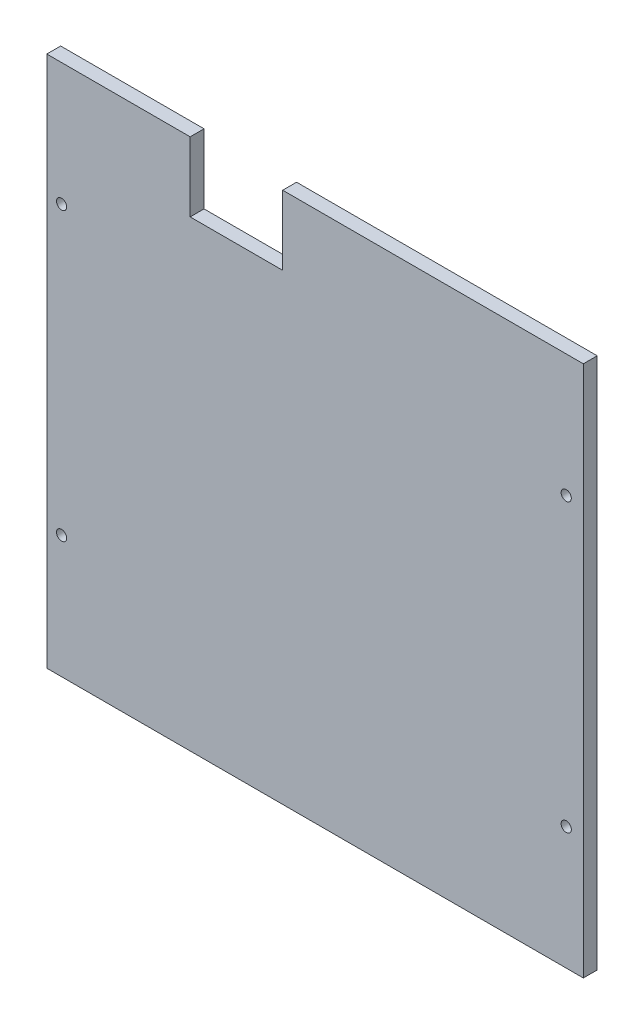
ISO-10303-21;
HEADER;
FILE_DESCRIPTION(('STEP AP214'),'2;1');
FILE_NAME('part.step','',(''),(''),'','','');
FILE_SCHEMA(('AUTOMOTIVE_DESIGN { 1 0 10303 214 1 1 1 1 }'));
ENDSEC;
DATA;
#1=APPLICATION_CONTEXT('core data for automotive mechanical design processes');
#2=APPLICATION_PROTOCOL_DEFINITION('international standard','automotive_design',2000,#1);
#3=PRODUCT_CONTEXT('',#1,'mechanical');
#4=PRODUCT('Part','Part','',(#3));
#5=PRODUCT_RELATED_PRODUCT_CATEGORY('part','',(#4));
#6=PRODUCT_DEFINITION_FORMATION('','',#4);
#7=PRODUCT_DEFINITION_CONTEXT('part definition',#1,'design');
#8=PRODUCT_DEFINITION('design','',#6,#7);
#9=PRODUCT_DEFINITION_SHAPE('','',#8);
#10=(LENGTH_UNIT() NAMED_UNIT(*) SI_UNIT(.MILLI.,.METRE.));
#11=(NAMED_UNIT(*) PLANE_ANGLE_UNIT() SI_UNIT($,.RADIAN.));
#12=(NAMED_UNIT(*) SI_UNIT($,.STERADIAN.) SOLID_ANGLE_UNIT());
#13=UNCERTAINTY_MEASURE_WITH_UNIT(LENGTH_MEASURE(1.E-05),#10,'distance_accuracy_value','');
#14=(GEOMETRIC_REPRESENTATION_CONTEXT(3) GLOBAL_UNCERTAINTY_ASSIGNED_CONTEXT((#13)) GLOBAL_UNIT_ASSIGNED_CONTEXT((#10,
#11,#12)) REPRESENTATION_CONTEXT('',''));
#15=CARTESIAN_POINT('',(0.,0.,0.));
#16=DIRECTION('',(0.,0.,1.));
#17=DIRECTION('',(1.,0.,0.));
#18=AXIS2_PLACEMENT_3D('',#15,#16,#17);
#19=CARTESIAN_POINT('',(-14.,85.,0.));
#20=DIRECTION('',(0.,1.,0.));
#21=DIRECTION('',(0.,0.,1.));
#22=AXIS2_PLACEMENT_3D('',#19,#20,#21);
#23=PLANE('',#22);
#24=DIRECTION('',(-1.,0.,0.));
#25=VECTOR('',#24,1.);
#26=CARTESIAN_POINT('',(-14.,85.,6.));
#27=LINE('',#26,#25);
#28=CARTESIAN_POINT('',(-14.,85.,6.));
#29=VERTEX_POINT('',#28);
#30=CARTESIAN_POINT('',(-54.,85.,6.));
#31=VERTEX_POINT('',#30);
#32=EDGE_CURVE('E127',#29,#31,#27,.T.);
#33=ORIENTED_EDGE('',*,*,#32,.F.);
#34=DIRECTION('',(0.,0.,1.));
#35=VECTOR('',#34,1.);
#36=CARTESIAN_POINT('',(-14.,85.,0.));
#37=LINE('',#36,#35);
#38=CARTESIAN_POINT('',(-14.,85.,0.));
#39=VERTEX_POINT('',#38);
#40=EDGE_CURVE('E11',#39,#29,#37,.T.);
#41=ORIENTED_EDGE('',*,*,#40,.F.);
#42=DIRECTION('',(-1.,0.,0.));
#43=VECTOR('',#42,1.);
#44=CARTESIAN_POINT('',(-14.,85.,0.));
#45=LINE('',#44,#43);
#46=CARTESIAN_POINT('',(-54.,85.,0.));
#47=VERTEX_POINT('',#46);
#48=EDGE_CURVE('E148',#39,#47,#45,.T.);
#49=ORIENTED_EDGE('',*,*,#48,.T.);
#50=DIRECTION('',(0.,0.,1.));
#51=VECTOR('',#50,1.);
#52=CARTESIAN_POINT('',(-54.,85.,0.));
#53=LINE('',#52,#51);
#54=EDGE_CURVE('E33',#47,#31,#53,.T.);
#55=ORIENTED_EDGE('',*,*,#54,.T.);
#56=EDGE_LOOP('',(#33,#41,#49,#55));
#57=FACE_BOUND('',#56,.T.);
#58=ADVANCED_FACE('F30',(#57),#23,.T.);
#59=CARTESIAN_POINT('',(-14.,115.,0.));
#60=DIRECTION('',(-1.,0.,0.));
#61=DIRECTION('',(0.,-1.,0.));
#62=AXIS2_PLACEMENT_3D('',#59,#60,#61);
#63=PLANE('',#62);
#64=DIRECTION('',(0.,-1.,0.));
#65=VECTOR('',#64,1.);
#66=CARTESIAN_POINT('',(-14.,115.,6.));
#67=LINE('',#66,#65);
#68=CARTESIAN_POINT('',(-14.,115.,6.));
#69=VERTEX_POINT('',#68);
#70=EDGE_CURVE('E146',#69,#29,#67,.T.);
#71=ORIENTED_EDGE('',*,*,#70,.F.);
#72=DIRECTION('',(0.,0.,1.));
#73=VECTOR('',#72,1.);
#74=CARTESIAN_POINT('',(-14.,115.,0.));
#75=LINE('',#74,#73);
#76=CARTESIAN_POINT('',(-14.,115.,0.));
#77=VERTEX_POINT('',#76);
#78=EDGE_CURVE('E39',#77,#69,#75,.T.);
#79=ORIENTED_EDGE('',*,*,#78,.F.);
#80=DIRECTION('',(0.,-1.,0.));
#81=VECTOR('',#80,1.);
#82=CARTESIAN_POINT('',(-14.,115.,0.));
#83=LINE('',#82,#81);
#84=EDGE_CURVE('E117',#77,#39,#83,.T.);
#85=ORIENTED_EDGE('',*,*,#84,.T.);
#86=ORIENTED_EDGE('',*,*,#40,.T.);
#87=EDGE_LOOP('',(#71,#79,#85,#86));
#88=FACE_BOUND('',#87,.T.);
#89=ADVANCED_FACE('F160',(#88),#63,.T.);
#90=CARTESIAN_POINT('',(116.,115.,0.));
#91=DIRECTION('',(0.,1.,0.));
#92=DIRECTION('',(0.,0.,1.));
#93=AXIS2_PLACEMENT_3D('',#90,#91,#92);
#94=PLANE('',#93);
#95=DIRECTION('',(-1.,0.,0.));
#96=VECTOR('',#95,1.);
#97=CARTESIAN_POINT('',(116.,115.,6.));
#98=LINE('',#97,#96);
#99=CARTESIAN_POINT('',(116.,115.,6.));
#100=VERTEX_POINT('',#99);
#101=EDGE_CURVE('E104',#100,#69,#98,.T.);
#102=ORIENTED_EDGE('',*,*,#101,.F.);
#103=DIRECTION('',(0.,0.,1.));
#104=VECTOR('',#103,1.);
#105=CARTESIAN_POINT('',(116.,115.,0.));
#106=LINE('',#105,#104);
#107=CARTESIAN_POINT('',(116.,115.,0.));
#108=VERTEX_POINT('',#107);
#109=EDGE_CURVE('E99',#108,#100,#106,.T.);
#110=ORIENTED_EDGE('',*,*,#109,.F.);
#111=DIRECTION('',(-1.,0.,0.));
#112=VECTOR('',#111,1.);
#113=CARTESIAN_POINT('',(116.,115.,0.));
#114=LINE('',#113,#112);
#115=EDGE_CURVE('E102',#108,#77,#114,.T.);
#116=ORIENTED_EDGE('',*,*,#115,.T.);
#117=ORIENTED_EDGE('',*,*,#78,.T.);
#118=EDGE_LOOP('',(#102,#110,#116,#117));
#119=FACE_BOUND('',#118,.T.);
#120=ADVANCED_FACE('F101',(#119),#94,.T.);
#121=CARTESIAN_POINT('',(116.,-115.,0.));
#122=DIRECTION('',(1.,0.,0.));
#123=DIRECTION('',(0.,1.,0.));
#124=AXIS2_PLACEMENT_3D('',#121,#122,#123);
#125=PLANE('',#124);
#126=DIRECTION('',(0.,1.,0.));
#127=VECTOR('',#126,1.);
#128=CARTESIAN_POINT('',(116.,-115.,6.));
#129=LINE('',#128,#127);
#130=CARTESIAN_POINT('',(116.,-115.,6.));
#131=VERTEX_POINT('',#130);
#132=EDGE_CURVE('E143',#131,#100,#129,.T.);
#133=ORIENTED_EDGE('',*,*,#132,.F.);
#134=DIRECTION('',(0.,0.,1.));
#135=VECTOR('',#134,1.);
#136=CARTESIAN_POINT('',(116.,-115.,0.));
#137=LINE('',#136,#135);
#138=CARTESIAN_POINT('',(116.,-115.,0.));
#139=VERTEX_POINT('',#138);
#140=EDGE_CURVE('E109',#139,#131,#137,.T.);
#141=ORIENTED_EDGE('',*,*,#140,.F.);
#142=DIRECTION('',(0.,1.,0.));
#143=VECTOR('',#142,1.);
#144=CARTESIAN_POINT('',(116.,-115.,0.));
#145=LINE('',#144,#143);
#146=EDGE_CURVE('E115',#139,#108,#145,.T.);
#147=ORIENTED_EDGE('',*,*,#146,.T.);
#148=ORIENTED_EDGE('',*,*,#109,.T.);
#149=EDGE_LOOP('',(#133,#141,#147,#148));
#150=FACE_BOUND('',#149,.T.);
#151=ADVANCED_FACE('F119',(#150),#125,.T.);
#152=CARTESIAN_POINT('',(-116.,-115.,0.));
#153=DIRECTION('',(0.,-1.,0.));
#154=DIRECTION('',(0.,0.,-1.));
#155=AXIS2_PLACEMENT_3D('',#152,#153,#154);
#156=PLANE('',#155);
#157=DIRECTION('',(1.,0.,0.));
#158=VECTOR('',#157,1.);
#159=CARTESIAN_POINT('',(-116.,-115.,6.));
#160=LINE('',#159,#158);
#161=CARTESIAN_POINT('',(-116.,-115.,6.));
#162=VERTEX_POINT('',#161);
#163=EDGE_CURVE('E140',#162,#131,#160,.T.);
#164=ORIENTED_EDGE('',*,*,#163,.F.);
#165=DIRECTION('',(0.,0.,1.));
#166=VECTOR('',#165,1.);
#167=CARTESIAN_POINT('',(-116.,-115.,0.));
#168=LINE('',#167,#166);
#169=CARTESIAN_POINT('',(-116.,-115.,0.));
#170=VERTEX_POINT('',#169);
#171=EDGE_CURVE('E152',#170,#162,#168,.T.);
#172=ORIENTED_EDGE('',*,*,#171,.F.);
#173=DIRECTION('',(1.,0.,0.));
#174=VECTOR('',#173,1.);
#175=CARTESIAN_POINT('',(-116.,-115.,0.));
#176=LINE('',#175,#174);
#177=EDGE_CURVE('E120',#170,#139,#176,.T.);
#178=ORIENTED_EDGE('',*,*,#177,.T.);
#179=ORIENTED_EDGE('',*,*,#140,.T.);
#180=EDGE_LOOP('',(#164,#172,#178,#179));
#181=FACE_BOUND('',#180,.T.);
#182=ADVANCED_FACE('F173',(#181),#156,.T.);
#183=CARTESIAN_POINT('',(-116.,115.,0.));
#184=DIRECTION('',(-1.,0.,0.));
#185=DIRECTION('',(0.,-1.,0.));
#186=AXIS2_PLACEMENT_3D('',#183,#184,#185);
#187=PLANE('',#186);
#188=DIRECTION('',(0.,-1.,0.));
#189=VECTOR('',#188,1.);
#190=CARTESIAN_POINT('',(-116.,115.,6.));
#191=LINE('',#190,#189);
#192=CARTESIAN_POINT('',(-116.,115.,6.));
#193=VERTEX_POINT('',#192);
#194=EDGE_CURVE('E137',#193,#162,#191,.T.);
#195=ORIENTED_EDGE('',*,*,#194,.F.);
#196=DIRECTION('',(0.,0.,1.));
#197=VECTOR('',#196,1.);
#198=CARTESIAN_POINT('',(-116.,115.,0.));
#199=LINE('',#198,#197);
#200=CARTESIAN_POINT('',(-116.,115.,0.));
#201=VERTEX_POINT('',#200);
#202=EDGE_CURVE('E154',#201,#193,#199,.T.);
#203=ORIENTED_EDGE('',*,*,#202,.F.);
#204=DIRECTION('',(0.,-1.,0.));
#205=VECTOR('',#204,1.);
#206=CARTESIAN_POINT('',(-116.,115.,0.));
#207=LINE('',#206,#205);
#208=EDGE_CURVE('E122',#201,#170,#207,.T.);
#209=ORIENTED_EDGE('',*,*,#208,.T.);
#210=ORIENTED_EDGE('',*,*,#171,.T.);
#211=EDGE_LOOP('',(#195,#203,#209,#210));
#212=FACE_BOUND('',#211,.T.);
#213=ADVANCED_FACE('F176',(#212),#187,.T.);
#214=CARTESIAN_POINT('',(-54.,115.,0.));
#215=DIRECTION('',(0.,1.,0.));
#216=DIRECTION('',(0.,0.,1.));
#217=AXIS2_PLACEMENT_3D('',#214,#215,#216);
#218=PLANE('',#217);
#219=DIRECTION('',(-1.,0.,0.));
#220=VECTOR('',#219,1.);
#221=CARTESIAN_POINT('',(-54.,115.,6.));
#222=LINE('',#221,#220);
#223=CARTESIAN_POINT('',(-54.,115.,6.));
#224=VERTEX_POINT('',#223);
#225=EDGE_CURVE('E134',#224,#193,#222,.T.);
#226=ORIENTED_EDGE('',*,*,#225,.F.);
#227=DIRECTION('',(0.,0.,1.));
#228=VECTOR('',#227,1.);
#229=CARTESIAN_POINT('',(-54.,115.,0.));
#230=LINE('',#229,#228);
#231=CARTESIAN_POINT('',(-54.,115.,0.));
#232=VERTEX_POINT('',#231);
#233=EDGE_CURVE('E155',#232,#224,#230,.T.);
#234=ORIENTED_EDGE('',*,*,#233,.F.);
#235=DIRECTION('',(-1.,0.,0.));
#236=VECTOR('',#235,1.);
#237=CARTESIAN_POINT('',(-54.,115.,0.));
#238=LINE('',#237,#236);
#239=EDGE_CURVE('E242',#232,#201,#238,.T.);
#240=ORIENTED_EDGE('',*,*,#239,.T.);
#241=ORIENTED_EDGE('',*,*,#202,.T.);
#242=EDGE_LOOP('',(#226,#234,#240,#241));
#243=FACE_BOUND('',#242,.T.);
#244=ADVANCED_FACE('F180',(#243),#218,.T.);
#245=CARTESIAN_POINT('',(-54.,85.,0.));
#246=DIRECTION('',(1.,0.,0.));
#247=DIRECTION('',(0.,0.,-1.));
#248=AXIS2_PLACEMENT_3D('',#245,#246,#247);
#249=PLANE('',#248);
#250=DIRECTION('',(0.,1.,0.));
#251=VECTOR('',#250,1.);
#252=CARTESIAN_POINT('',(-54.,85.,6.));
#253=LINE('',#252,#251);
#254=EDGE_CURVE('E130',#31,#224,#253,.T.);
#255=ORIENTED_EDGE('',*,*,#254,.F.);
#256=ORIENTED_EDGE('',*,*,#54,.F.);
#257=DIRECTION('',(0.,1.,0.));
#258=VECTOR('',#257,1.);
#259=CARTESIAN_POINT('',(-54.,85.,0.));
#260=LINE('',#259,#258);
#261=EDGE_CURVE('E240',#47,#232,#260,.T.);
#262=ORIENTED_EDGE('',*,*,#261,.T.);
#263=ORIENTED_EDGE('',*,*,#233,.T.);
#264=EDGE_LOOP('',(#255,#256,#262,#263));
#265=FACE_BOUND('',#264,.T.);
#266=ADVANCED_FACE('F157',(#265),#249,.T.);
#267=CARTESIAN_POINT('',(-54.,85.,0.));
#268=DIRECTION('',(0.,0.,-1.));
#269=DIRECTION('',(-1.,0.,0.));
#270=AXIS2_PLACEMENT_3D('',#267,#268,#269);
#271=PLANE('',#270);
#272=CARTESIAN_POINT('',(-109.6,-62.0000000000003,0.));
#273=DIRECTION('',(0.,0.,1.));
#274=DIRECTION('',(-1.,0.,0.));
#275=AXIS2_PLACEMENT_3D('',#272,#273,#274);
#276=CIRCLE('',#275,2.19999999999999);
#277=CARTESIAN_POINT('',(-111.8,-62.0000000000003,0.));
#278=VERTEX_POINT('',#277);
#279=EDGE_CURVE('E215',#278,#278,#276,.T.);
#280=ORIENTED_EDGE('',*,*,#279,.T.);
#281=EDGE_LOOP('',(#280));
#282=FACE_BOUND('',#281,.T.);
#283=CARTESIAN_POINT('',(108.6,62.0000000000001,0.));
#284=DIRECTION('',(0.,0.,1.));
#285=DIRECTION('',(-1.,0.,0.));
#286=AXIS2_PLACEMENT_3D('',#283,#284,#285);
#287=CIRCLE('',#286,2.19999999999999);
#288=CARTESIAN_POINT('',(106.4,62.0000000000001,0.));
#289=VERTEX_POINT('',#288);
#290=EDGE_CURVE('E223',#289,#289,#287,.T.);
#291=ORIENTED_EDGE('',*,*,#290,.T.);
#292=EDGE_LOOP('',(#291));
#293=FACE_BOUND('',#292,.T.);
#294=CARTESIAN_POINT('',(108.6,-62.,0.));
#295=DIRECTION('',(0.,0.,1.));
#296=DIRECTION('',(-1.,0.,0.));
#297=AXIS2_PLACEMENT_3D('',#294,#295,#296);
#298=CIRCLE('',#297,2.19999999999999);
#299=CARTESIAN_POINT('',(106.4,-62.,0.));
#300=VERTEX_POINT('',#299);
#301=EDGE_CURVE('E229',#300,#300,#298,.T.);
#302=ORIENTED_EDGE('',*,*,#301,.T.);
#303=EDGE_LOOP('',(#302));
#304=FACE_BOUND('',#303,.T.);
#305=CARTESIAN_POINT('',(-109.6,61.9999999999997,0.));
#306=DIRECTION('',(0.,0.,1.));
#307=DIRECTION('',(-1.,0.,0.));
#308=AXIS2_PLACEMENT_3D('',#305,#306,#307);
#309=CIRCLE('',#308,2.19999999999999);
#310=CARTESIAN_POINT('',(-111.8,61.9999999999997,0.));
#311=VERTEX_POINT('',#310);
#312=EDGE_CURVE('E131',#311,#311,#309,.T.);
#313=ORIENTED_EDGE('',*,*,#312,.T.);
#314=EDGE_LOOP('',(#313));
#315=FACE_BOUND('',#314,.T.);
#316=ORIENTED_EDGE('',*,*,#48,.F.);
#317=ORIENTED_EDGE('',*,*,#84,.F.);
#318=ORIENTED_EDGE('',*,*,#115,.F.);
#319=ORIENTED_EDGE('',*,*,#146,.F.);
#320=ORIENTED_EDGE('',*,*,#177,.F.);
#321=ORIENTED_EDGE('',*,*,#208,.F.);
#322=ORIENTED_EDGE('',*,*,#239,.F.);
#323=ORIENTED_EDGE('',*,*,#261,.F.);
#324=EDGE_LOOP('',(#316,#317,#318,#319,#320,#321,#322,#323));
#325=FACE_BOUND('',#324,.T.);
#326=ADVANCED_FACE('F113',(#282,#293,#304,#315,#325),#271,.T.);
#327=CARTESIAN_POINT('',(-54.,85.,6.));
#328=DIRECTION('',(0.,0.,-1.));
#329=DIRECTION('',(-1.,0.,0.));
#330=AXIS2_PLACEMENT_3D('',#327,#328,#329);
#331=PLANE('',#330);
#332=CARTESIAN_POINT('',(-109.6,-62.0000000000003,6.));
#333=DIRECTION('',(0.,0.,1.));
#334=DIRECTION('',(-1.,0.,0.));
#335=AXIS2_PLACEMENT_3D('',#332,#333,#334);
#336=CIRCLE('',#335,2.19999999999999);
#337=CARTESIAN_POINT('',(-111.8,-62.0000000000003,6.));
#338=VERTEX_POINT('',#337);
#339=EDGE_CURVE('E218',#338,#338,#336,.T.);
#340=ORIENTED_EDGE('',*,*,#339,.F.);
#341=EDGE_LOOP('',(#340));
#342=FACE_BOUND('',#341,.T.);
#343=CARTESIAN_POINT('',(108.6,62.0000000000001,6.));
#344=DIRECTION('',(0.,0.,1.));
#345=DIRECTION('',(-1.,0.,0.));
#346=AXIS2_PLACEMENT_3D('',#343,#344,#345);
#347=CIRCLE('',#346,2.19999999999999);
#348=CARTESIAN_POINT('',(106.4,62.0000000000001,6.));
#349=VERTEX_POINT('',#348);
#350=EDGE_CURVE('E220',#349,#349,#347,.T.);
#351=ORIENTED_EDGE('',*,*,#350,.F.);
#352=EDGE_LOOP('',(#351));
#353=FACE_BOUND('',#352,.T.);
#354=CARTESIAN_POINT('',(108.6,-62.,6.));
#355=DIRECTION('',(0.,0.,1.));
#356=DIRECTION('',(-1.,0.,0.));
#357=AXIS2_PLACEMENT_3D('',#354,#355,#356);
#358=CIRCLE('',#357,2.19999999999999);
#359=CARTESIAN_POINT('',(106.4,-62.,6.));
#360=VERTEX_POINT('',#359);
#361=EDGE_CURVE('E226',#360,#360,#358,.T.);
#362=ORIENTED_EDGE('',*,*,#361,.F.);
#363=EDGE_LOOP('',(#362));
#364=FACE_BOUND('',#363,.T.);
#365=CARTESIAN_POINT('',(-109.6,61.9999999999997,6.));
#366=DIRECTION('',(0.,0.,1.));
#367=DIRECTION('',(-1.,0.,0.));
#368=AXIS2_PLACEMENT_3D('',#365,#366,#367);
#369=CIRCLE('',#368,2.19999999999999);
#370=CARTESIAN_POINT('',(-111.8,61.9999999999997,6.));
#371=VERTEX_POINT('',#370);
#372=EDGE_CURVE('E232',#371,#371,#369,.T.);
#373=ORIENTED_EDGE('',*,*,#372,.F.);
#374=EDGE_LOOP('',(#373));
#375=FACE_BOUND('',#374,.T.);
#376=ORIENTED_EDGE('',*,*,#32,.T.);
#377=ORIENTED_EDGE('',*,*,#254,.T.);
#378=ORIENTED_EDGE('',*,*,#225,.T.);
#379=ORIENTED_EDGE('',*,*,#194,.T.);
#380=ORIENTED_EDGE('',*,*,#163,.T.);
#381=ORIENTED_EDGE('',*,*,#132,.T.);
#382=ORIENTED_EDGE('',*,*,#101,.T.);
#383=ORIENTED_EDGE('',*,*,#70,.T.);
#384=EDGE_LOOP('',(#376,#377,#378,#379,#380,#381,#382,#383));
#385=FACE_BOUND('',#384,.T.);
#386=ADVANCED_FACE('F159',(#342,#353,#364,#375,#385),#331,.F.);
#387=CARTESIAN_POINT('',(-109.6,61.9999999999997,0.));
#388=DIRECTION('',(0.,0.,1.));
#389=DIRECTION('',(1.,0.,0.));
#390=AXIS2_PLACEMENT_3D('',#387,#388,#389);
#391=CYLINDRICAL_SURFACE('',#390,2.19999999999999);
#392=ORIENTED_EDGE('',*,*,#312,.F.);
#393=EDGE_LOOP('',(#392));
#394=FACE_BOUND('',#393,.T.);
#395=ORIENTED_EDGE('',*,*,#372,.T.);
#396=EDGE_LOOP('',(#395));
#397=FACE_BOUND('',#396,.T.);
#398=ADVANCED_FACE('F192',(#394,#397),#391,.F.);
#399=CARTESIAN_POINT('',(108.6,-62.,0.));
#400=DIRECTION('',(0.,0.,1.));
#401=DIRECTION('',(1.,0.,0.));
#402=AXIS2_PLACEMENT_3D('',#399,#400,#401);
#403=CYLINDRICAL_SURFACE('',#402,2.19999999999999);
#404=ORIENTED_EDGE('',*,*,#301,.F.);
#405=EDGE_LOOP('',(#404));
#406=FACE_BOUND('',#405,.T.);
#407=ORIENTED_EDGE('',*,*,#361,.T.);
#408=EDGE_LOOP('',(#407));
#409=FACE_BOUND('',#408,.T.);
#410=ADVANCED_FACE('F199',(#406,#409),#403,.F.);
#411=CARTESIAN_POINT('',(108.6,62.0000000000001,0.));
#412=DIRECTION('',(0.,0.,1.));
#413=DIRECTION('',(1.,0.,0.));
#414=AXIS2_PLACEMENT_3D('',#411,#412,#413);
#415=CYLINDRICAL_SURFACE('',#414,2.19999999999999);
#416=ORIENTED_EDGE('',*,*,#290,.F.);
#417=EDGE_LOOP('',(#416));
#418=FACE_BOUND('',#417,.T.);
#419=ORIENTED_EDGE('',*,*,#350,.T.);
#420=EDGE_LOOP('',(#419));
#421=FACE_BOUND('',#420,.T.);
#422=ADVANCED_FACE('F203',(#418,#421),#415,.F.);
#423=CARTESIAN_POINT('',(-109.6,-62.0000000000003,0.));
#424=DIRECTION('',(0.,0.,1.));
#425=DIRECTION('',(1.,0.,0.));
#426=AXIS2_PLACEMENT_3D('',#423,#424,#425);
#427=CYLINDRICAL_SURFACE('',#426,2.19999999999999);
#428=ORIENTED_EDGE('',*,*,#279,.F.);
#429=EDGE_LOOP('',(#428));
#430=FACE_BOUND('',#429,.T.);
#431=ORIENTED_EDGE('',*,*,#339,.T.);
#432=EDGE_LOOP('',(#431));
#433=FACE_BOUND('',#432,.T.);
#434=ADVANCED_FACE('F207',(#430,#433),#427,.F.);
#435=CLOSED_SHELL('',(#58,#89,#120,#151,#182,#213,#244,#266,#326,#386,#398,#410,#422,#434));
#436=MANIFOLD_SOLID_BREP('B2',#435);
#437=ADVANCED_BREP_SHAPE_REPRESENTATION('',(#18,#436),#14);
#438=SHAPE_DEFINITION_REPRESENTATION(#9,#437);
ENDSEC;
END-ISO-10303-21;
